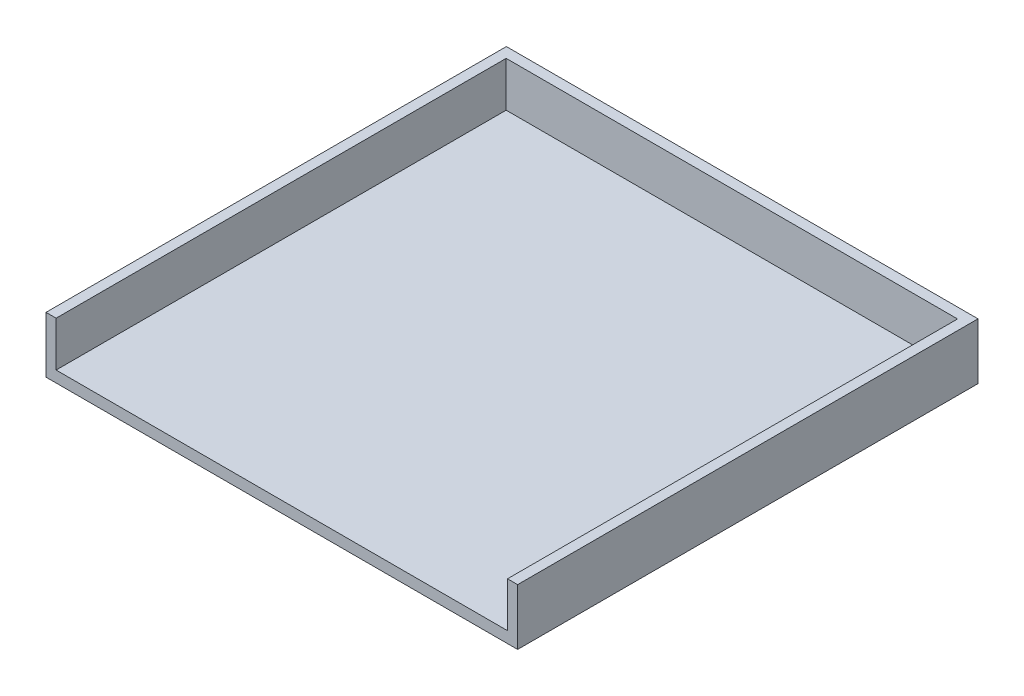
ISO-10303-21;
HEADER;
FILE_DESCRIPTION(('STEP AP214'),'2;1');
FILE_NAME('part.step','',(''),(''),'','','');
FILE_SCHEMA(('AUTOMOTIVE_DESIGN { 1 0 10303 214 1 1 1 1 }'));
ENDSEC;
DATA;
#1=APPLICATION_CONTEXT('core data for automotive mechanical design processes');
#2=APPLICATION_PROTOCOL_DEFINITION('international standard','automotive_design',2000,#1);
#3=PRODUCT_CONTEXT('',#1,'mechanical');
#4=PRODUCT('Part','Part','',(#3));
#5=PRODUCT_RELATED_PRODUCT_CATEGORY('part','',(#4));
#6=PRODUCT_DEFINITION_FORMATION('','',#4);
#7=PRODUCT_DEFINITION_CONTEXT('part definition',#1,'design');
#8=PRODUCT_DEFINITION('design','',#6,#7);
#9=PRODUCT_DEFINITION_SHAPE('','',#8);
#10=(LENGTH_UNIT() NAMED_UNIT(*) SI_UNIT(.MILLI.,.METRE.));
#11=(NAMED_UNIT(*) PLANE_ANGLE_UNIT() SI_UNIT($,.RADIAN.));
#12=(NAMED_UNIT(*) SI_UNIT($,.STERADIAN.) SOLID_ANGLE_UNIT());
#13=UNCERTAINTY_MEASURE_WITH_UNIT(LENGTH_MEASURE(1.E-05),#10,'distance_accuracy_value','');
#14=(GEOMETRIC_REPRESENTATION_CONTEXT(3) GLOBAL_UNCERTAINTY_ASSIGNED_CONTEXT((#13)) GLOBAL_UNIT_ASSIGNED_CONTEXT((#10,
#11,#12)) REPRESENTATION_CONTEXT('',''));
#15=CARTESIAN_POINT('',(0.,0.,0.));
#16=DIRECTION('',(0.,0.,1.));
#17=DIRECTION('',(1.,0.,0.));
#18=AXIS2_PLACEMENT_3D('',#15,#16,#17);
#19=CARTESIAN_POINT('',(5.01379908946576,2.5,12.1259844225507));
#20=DIRECTION('',(1.,0.,0.));
#21=DIRECTION('',(0.,0.,-1.));
#22=AXIS2_PLACEMENT_3D('',#19,#20,#21);
#23=PLANE('',#22);
#24=DIRECTION('',(0.,0.,1.));
#25=VECTOR('',#24,1.);
#26=CARTESIAN_POINT('',(5.01379908946576,0.,12.1259844225507));
#27=LINE('',#26,#25);
#28=CARTESIAN_POINT('',(5.01379908946576,0.,12.1259844225507));
#29=VERTEX_POINT('',#28);
#30=CARTESIAN_POINT('',(5.01379908946577,0.,114.625984422551));
#31=VERTEX_POINT('',#30);
#32=EDGE_CURVE('E102',#29,#31,#27,.T.);
#33=ORIENTED_EDGE('',*,*,#32,.T.);
#34=DIRECTION('',(0.,-1.,0.));
#35=VECTOR('',#34,1.);
#36=CARTESIAN_POINT('',(5.01379908946577,2.5,114.625984422551));
#37=LINE('',#36,#35);
#38=CARTESIAN_POINT('',(5.01379908946576,12.5,114.625984422551));
#39=VERTEX_POINT('',#38);
#40=EDGE_CURVE('E11',#39,#31,#37,.T.);
#41=ORIENTED_EDGE('',*,*,#40,.F.);
#42=DIRECTION('',(0.,0.,1.));
#43=VECTOR('',#42,1.);
#44=CARTESIAN_POINT('',(5.01379908946576,12.5,12.1259844225507));
#45=LINE('',#44,#43);
#46=CARTESIAN_POINT('',(5.01379908946576,12.5,12.1259844225507));
#47=VERTEX_POINT('',#46);
#48=EDGE_CURVE('E100',#47,#39,#45,.T.);
#49=ORIENTED_EDGE('',*,*,#48,.F.);
#50=DIRECTION('',(0.,-1.,0.));
#51=VECTOR('',#50,1.);
#52=CARTESIAN_POINT('',(5.01379908946576,2.5,12.1259844225507));
#53=LINE('',#52,#51);
#54=EDGE_CURVE('E148',#47,#29,#53,.T.);
#55=ORIENTED_EDGE('',*,*,#54,.T.);
#56=EDGE_LOOP('',(#33,#41,#49,#55));
#57=FACE_BOUND('',#56,.T.);
#58=ADVANCED_FACE('F35',(#57),#23,.F.);
#59=CARTESIAN_POINT('',(5.01379908946577,2.5,114.625984422551));
#60=DIRECTION('',(0.,0.,-1.));
#61=DIRECTION('',(-1.,0.,0.));
#62=AXIS2_PLACEMENT_3D('',#59,#60,#61);
#63=PLANE('',#62);
#64=DIRECTION('',(1.,0.,0.));
#65=VECTOR('',#64,1.);
#66=CARTESIAN_POINT('',(5.01379908946577,0.,114.625984422551));
#67=LINE('',#66,#65);
#68=CARTESIAN_POINT('',(110.013799089466,0.,114.625984422551));
#69=VERTEX_POINT('',#68);
#70=EDGE_CURVE('E151',#31,#69,#67,.T.);
#71=ORIENTED_EDGE('',*,*,#70,.T.);
#72=DIRECTION('',(0.,-1.,0.));
#73=VECTOR('',#72,1.);
#74=CARTESIAN_POINT('',(110.013799089466,2.5,114.625984422551));
#75=LINE('',#74,#73);
#76=CARTESIAN_POINT('',(110.013799089466,12.5,114.625984422551));
#77=VERTEX_POINT('',#76);
#78=EDGE_CURVE('E42',#77,#69,#75,.T.);
#79=ORIENTED_EDGE('',*,*,#78,.F.);
#80=DIRECTION('',(1.,0.,0.));
#81=VECTOR('',#80,1.);
#82=CARTESIAN_POINT('',(107.763799089466,12.5,114.625984422551));
#83=LINE('',#82,#81);
#84=CARTESIAN_POINT('',(107.763799089466,12.5,114.625984422551));
#85=VERTEX_POINT('',#84);
#86=EDGE_CURVE('E127',#85,#77,#83,.T.);
#87=ORIENTED_EDGE('',*,*,#86,.F.);
#88=DIRECTION('',(0.,-1.,0.));
#89=VECTOR('',#88,1.);
#90=CARTESIAN_POINT('',(107.763799089466,12.5,114.625984422551));
#91=LINE('',#90,#89);
#92=CARTESIAN_POINT('',(107.763799089466,2.5,114.625984422551));
#93=VERTEX_POINT('',#92);
#94=EDGE_CURVE('E133',#85,#93,#91,.T.);
#95=ORIENTED_EDGE('',*,*,#94,.T.);
#96=DIRECTION('',(1.,0.,0.));
#97=VECTOR('',#96,1.);
#98=CARTESIAN_POINT('',(5.01379908946577,2.5,114.625984422551));
#99=LINE('',#98,#97);
#100=CARTESIAN_POINT('',(7.26379908946576,2.5,114.625984422551));
#101=VERTEX_POINT('',#100);
#102=EDGE_CURVE('E54',#101,#93,#99,.T.);
#103=ORIENTED_EDGE('',*,*,#102,.F.);
#104=DIRECTION('',(0.,-1.,0.));
#105=VECTOR('',#104,1.);
#106=CARTESIAN_POINT('',(7.26379908946577,12.5,114.625984422551));
#107=LINE('',#106,#105);
#108=CARTESIAN_POINT('',(7.26379908946577,12.5,114.625984422551));
#109=VERTEX_POINT('',#108);
#110=EDGE_CURVE('E108',#109,#101,#107,.T.);
#111=ORIENTED_EDGE('',*,*,#110,.F.);
#112=DIRECTION('',(1.,0.,0.));
#113=VECTOR('',#112,1.);
#114=CARTESIAN_POINT('',(5.01379908946576,12.5,114.625984422551));
#115=LINE('',#114,#113);
#116=EDGE_CURVE('E105',#39,#109,#115,.T.);
#117=ORIENTED_EDGE('',*,*,#116,.F.);
#118=ORIENTED_EDGE('',*,*,#40,.T.);
#119=EDGE_LOOP('',(#71,#79,#87,#95,#103,#111,#117,#118));
#120=FACE_BOUND('',#119,.T.);
#121=ADVANCED_FACE('F106',(#120),#63,.F.);
#122=CARTESIAN_POINT('',(110.013799089466,2.5,12.1259844225507));
#123=DIRECTION('',(-1.,0.,0.));
#124=DIRECTION('',(0.,0.,1.));
#125=AXIS2_PLACEMENT_3D('',#122,#123,#124);
#126=PLANE('',#125);
#127=DIRECTION('',(0.,0.,-1.));
#128=VECTOR('',#127,1.);
#129=CARTESIAN_POINT('',(110.013799089466,0.,12.1259844225507));
#130=LINE('',#129,#128);
#131=CARTESIAN_POINT('',(110.013799089466,0.,12.1259844225507));
#132=VERTEX_POINT('',#131);
#133=EDGE_CURVE('E153',#69,#132,#130,.T.);
#134=ORIENTED_EDGE('',*,*,#133,.T.);
#135=DIRECTION('',(0.,-1.,0.));
#136=VECTOR('',#135,1.);
#137=CARTESIAN_POINT('',(110.013799089466,2.5,12.1259844225507));
#138=LINE('',#137,#136);
#139=CARTESIAN_POINT('',(110.013799089466,12.5,12.1259844225507));
#140=VERTEX_POINT('',#139);
#141=EDGE_CURVE('E157',#140,#132,#138,.T.);
#142=ORIENTED_EDGE('',*,*,#141,.F.);
#143=DIRECTION('',(0.,0.,-1.));
#144=VECTOR('',#143,1.);
#145=CARTESIAN_POINT('',(110.013799089466,12.5,12.1259844225507));
#146=LINE('',#145,#144);
#147=EDGE_CURVE('E130',#77,#140,#146,.T.);
#148=ORIENTED_EDGE('',*,*,#147,.F.);
#149=ORIENTED_EDGE('',*,*,#78,.T.);
#150=EDGE_LOOP('',(#134,#142,#148,#149));
#151=FACE_BOUND('',#150,.T.);
#152=ADVANCED_FACE('F163',(#151),#126,.F.);
#153=CARTESIAN_POINT('',(5.01379908946576,2.5,12.1259844225507));
#154=DIRECTION('',(0.,0.,1.));
#155=DIRECTION('',(1.,0.,0.));
#156=AXIS2_PLACEMENT_3D('',#153,#154,#155);
#157=PLANE('',#156);
#158=DIRECTION('',(-1.,0.,0.));
#159=VECTOR('',#158,1.);
#160=CARTESIAN_POINT('',(5.01379908946576,0.,12.1259844225507));
#161=LINE('',#160,#159);
#162=EDGE_CURVE('E149',#132,#29,#161,.T.);
#163=ORIENTED_EDGE('',*,*,#162,.T.);
#164=ORIENTED_EDGE('',*,*,#54,.F.);
#165=DIRECTION('',(-1.,0.,0.));
#166=VECTOR('',#165,1.);
#167=CARTESIAN_POINT('',(5.01379908946576,12.5,12.1259844225507));
#168=LINE('',#167,#166);
#169=EDGE_CURVE('E117',#140,#47,#168,.T.);
#170=ORIENTED_EDGE('',*,*,#169,.F.);
#171=ORIENTED_EDGE('',*,*,#141,.T.);
#172=EDGE_LOOP('',(#163,#164,#170,#171));
#173=FACE_BOUND('',#172,.T.);
#174=ADVANCED_FACE('F169',(#173),#157,.F.);
#175=CARTESIAN_POINT('',(0.,2.5,0.));
#176=DIRECTION('',(0.,1.,0.));
#177=DIRECTION('',(0.,0.,1.));
#178=AXIS2_PLACEMENT_3D('',#175,#176,#177);
#179=PLANE('',#178);
#180=DIRECTION('',(0.,0.,1.));
#181=VECTOR('',#180,1.);
#182=CARTESIAN_POINT('',(107.763799089466,2.5,112.909428800642));
#183=LINE('',#182,#181);
#184=CARTESIAN_POINT('',(107.763799089466,2.5,14.4259844225507));
#185=VERTEX_POINT('',#184);
#186=EDGE_CURVE('E49',#185,#93,#183,.T.);
#187=ORIENTED_EDGE('',*,*,#186,.F.);
#188=DIRECTION('',(1.,0.,0.));
#189=VECTOR('',#188,1.);
#190=CARTESIAN_POINT('',(7.26379908946576,2.5,14.4259844225507));
#191=LINE('',#190,#189);
#192=CARTESIAN_POINT('',(7.26379908946576,2.5,14.4259844225507));
#193=VERTEX_POINT('',#192);
#194=EDGE_CURVE('E119',#193,#185,#191,.T.);
#195=ORIENTED_EDGE('',*,*,#194,.F.);
#196=DIRECTION('',(0.,0.,-1.));
#197=VECTOR('',#196,1.);
#198=CARTESIAN_POINT('',(7.26379908946576,2.5,14.4259844225507));
#199=LINE('',#198,#197);
#200=EDGE_CURVE('E134',#101,#193,#199,.T.);
#201=ORIENTED_EDGE('',*,*,#200,.F.);
#202=ORIENTED_EDGE('',*,*,#102,.T.);
#203=EDGE_LOOP('',(#187,#195,#201,#202));
#204=FACE_BOUND('',#203,.T.);
#205=ADVANCED_FACE('F179',(#204),#179,.T.);
#206=CARTESIAN_POINT('',(0.,0.,0.));
#207=DIRECTION('',(0.,1.,0.));
#208=DIRECTION('',(0.,0.,1.));
#209=AXIS2_PLACEMENT_3D('',#206,#207,#208);
#210=PLANE('',#209);
#211=ORIENTED_EDGE('',*,*,#32,.F.);
#212=ORIENTED_EDGE('',*,*,#162,.F.);
#213=ORIENTED_EDGE('',*,*,#133,.F.);
#214=ORIENTED_EDGE('',*,*,#70,.F.);
#215=EDGE_LOOP('',(#211,#212,#213,#214));
#216=FACE_BOUND('',#215,.T.);
#217=ADVANCED_FACE('F167',(#216),#210,.F.);
#218=CARTESIAN_POINT('',(7.26379908946576,12.5,14.4259844225507));
#219=DIRECTION('',(-1.,0.,0.));
#220=DIRECTION('',(0.,0.,1.));
#221=AXIS2_PLACEMENT_3D('',#218,#219,#220);
#222=PLANE('',#221);
#223=ORIENTED_EDGE('',*,*,#200,.T.);
#224=DIRECTION('',(0.,-1.,0.));
#225=VECTOR('',#224,1.);
#226=CARTESIAN_POINT('',(7.26379908946576,12.5,14.4259844225507));
#227=LINE('',#226,#225);
#228=CARTESIAN_POINT('',(7.26379908946576,12.5,14.4259844225507));
#229=VERTEX_POINT('',#228);
#230=EDGE_CURVE('E143',#229,#193,#227,.T.);
#231=ORIENTED_EDGE('',*,*,#230,.F.);
#232=DIRECTION('',(0.,0.,-1.));
#233=VECTOR('',#232,1.);
#234=CARTESIAN_POINT('',(7.26379908946577,12.5,112.909428800642));
#235=LINE('',#234,#233);
#236=EDGE_CURVE('E111',#109,#229,#235,.T.);
#237=ORIENTED_EDGE('',*,*,#236,.F.);
#238=ORIENTED_EDGE('',*,*,#110,.T.);
#239=EDGE_LOOP('',(#223,#231,#237,#238));
#240=FACE_BOUND('',#239,.T.);
#241=ADVANCED_FACE('F181',(#240),#222,.F.);
#242=CARTESIAN_POINT('',(7.26379908946576,12.5,14.4259844225507));
#243=DIRECTION('',(0.,0.,-1.));
#244=DIRECTION('',(-1.,0.,0.));
#245=AXIS2_PLACEMENT_3D('',#242,#243,#244);
#246=PLANE('',#245);
#247=ORIENTED_EDGE('',*,*,#194,.T.);
#248=DIRECTION('',(0.,-1.,0.));
#249=VECTOR('',#248,1.);
#250=CARTESIAN_POINT('',(107.763799089466,12.5,14.4259844225507));
#251=LINE('',#250,#249);
#252=CARTESIAN_POINT('',(107.763799089466,12.5,14.4259844225507));
#253=VERTEX_POINT('',#252);
#254=EDGE_CURVE('E140',#253,#185,#251,.T.);
#255=ORIENTED_EDGE('',*,*,#254,.F.);
#256=DIRECTION('',(1.,0.,0.));
#257=VECTOR('',#256,1.);
#258=CARTESIAN_POINT('',(7.26379908946576,12.5,14.4259844225507));
#259=LINE('',#258,#257);
#260=EDGE_CURVE('E123',#229,#253,#259,.T.);
#261=ORIENTED_EDGE('',*,*,#260,.F.);
#262=ORIENTED_EDGE('',*,*,#230,.T.);
#263=EDGE_LOOP('',(#247,#255,#261,#262));
#264=FACE_BOUND('',#263,.T.);
#265=ADVANCED_FACE('F177',(#264),#246,.F.);
#266=CARTESIAN_POINT('',(107.763799089466,12.5,112.909428800642));
#267=DIRECTION('',(1.,0.,0.));
#268=DIRECTION('',(0.,0.,-1.));
#269=AXIS2_PLACEMENT_3D('',#266,#267,#268);
#270=PLANE('',#269);
#271=ORIENTED_EDGE('',*,*,#186,.T.);
#272=ORIENTED_EDGE('',*,*,#94,.F.);
#273=DIRECTION('',(0.,0.,1.));
#274=VECTOR('',#273,1.);
#275=CARTESIAN_POINT('',(107.763799089466,12.5,14.4259844225507));
#276=LINE('',#275,#274);
#277=EDGE_CURVE('E125',#253,#85,#276,.T.);
#278=ORIENTED_EDGE('',*,*,#277,.F.);
#279=ORIENTED_EDGE('',*,*,#254,.T.);
#280=EDGE_LOOP('',(#271,#272,#278,#279));
#281=FACE_BOUND('',#280,.T.);
#282=ADVANCED_FACE('F173',(#281),#270,.F.);
#283=CARTESIAN_POINT('',(0.,12.5,0.));
#284=DIRECTION('',(0.,1.,0.));
#285=DIRECTION('',(0.,0.,1.));
#286=AXIS2_PLACEMENT_3D('',#283,#284,#285);
#287=PLANE('',#286);
#288=ORIENTED_EDGE('',*,*,#48,.T.);
#289=ORIENTED_EDGE('',*,*,#116,.T.);
#290=ORIENTED_EDGE('',*,*,#236,.T.);
#291=ORIENTED_EDGE('',*,*,#260,.T.);
#292=ORIENTED_EDGE('',*,*,#277,.T.);
#293=ORIENTED_EDGE('',*,*,#86,.T.);
#294=ORIENTED_EDGE('',*,*,#147,.T.);
#295=ORIENTED_EDGE('',*,*,#169,.T.);
#296=EDGE_LOOP('',(#288,#289,#290,#291,#292,#293,#294,#295));
#297=FACE_BOUND('',#296,.T.);
#298=ADVANCED_FACE('F114',(#297),#287,.T.);
#299=CLOSED_SHELL('',(#58,#121,#152,#174,#205,#217,#241,#265,#282,#298));
#300=MANIFOLD_SOLID_BREP('B2',#299);
#301=ADVANCED_BREP_SHAPE_REPRESENTATION('',(#18,#300),#14);
#302=SHAPE_DEFINITION_REPRESENTATION(#9,#301);
ENDSEC;
END-ISO-10303-21;
